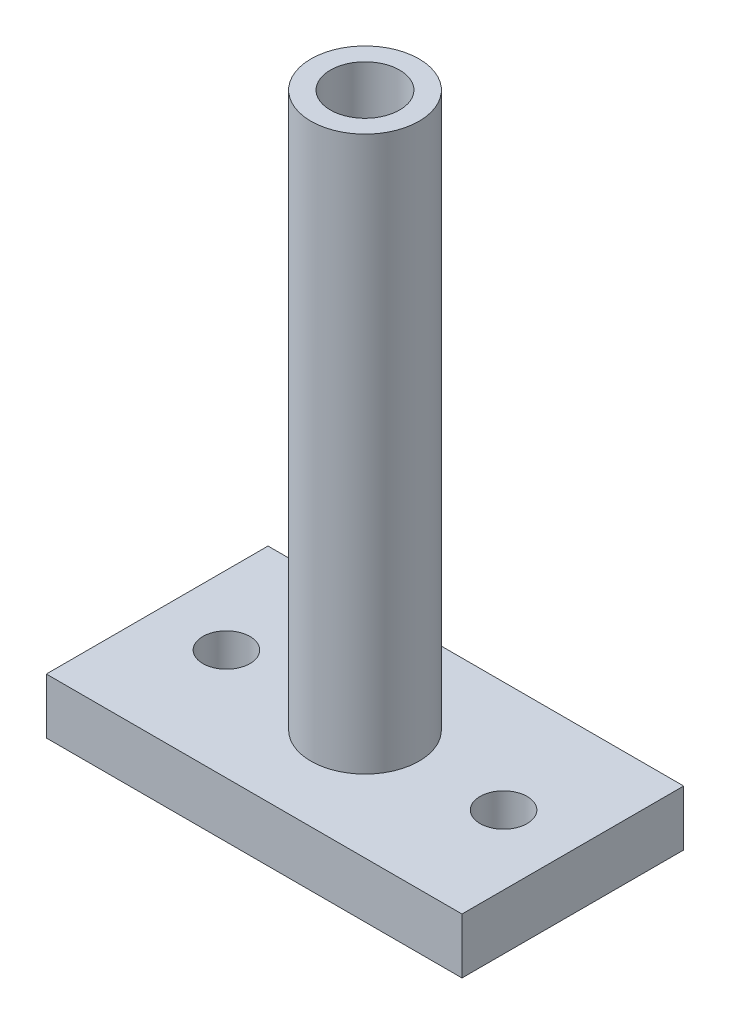
ISO-10303-21;
HEADER;
FILE_DESCRIPTION(('STEP AP214'),'2;1');
FILE_NAME('part.step','',(''),(''),'','','');
FILE_SCHEMA(('AUTOMOTIVE_DESIGN { 1 0 10303 214 1 1 1 1 }'));
ENDSEC;
DATA;
#1=APPLICATION_CONTEXT('core data for automotive mechanical design processes');
#2=APPLICATION_PROTOCOL_DEFINITION('international standard','automotive_design',2000,#1);
#3=PRODUCT_CONTEXT('',#1,'mechanical');
#4=PRODUCT('Part','Part','',(#3));
#5=PRODUCT_RELATED_PRODUCT_CATEGORY('part','',(#4));
#6=PRODUCT_DEFINITION_FORMATION('','',#4);
#7=PRODUCT_DEFINITION_CONTEXT('part definition',#1,'design');
#8=PRODUCT_DEFINITION('design','',#6,#7);
#9=PRODUCT_DEFINITION_SHAPE('','',#8);
#10=(LENGTH_UNIT() NAMED_UNIT(*) SI_UNIT(.MILLI.,.METRE.));
#11=(NAMED_UNIT(*) PLANE_ANGLE_UNIT() SI_UNIT($,.RADIAN.));
#12=(NAMED_UNIT(*) SI_UNIT($,.STERADIAN.) SOLID_ANGLE_UNIT());
#13=UNCERTAINTY_MEASURE_WITH_UNIT(LENGTH_MEASURE(1.E-05),#10,'distance_accuracy_value','');
#14=(GEOMETRIC_REPRESENTATION_CONTEXT(3) GLOBAL_UNCERTAINTY_ASSIGNED_CONTEXT((#13)) GLOBAL_UNIT_ASSIGNED_CONTEXT((#10,
#11,#12)) REPRESENTATION_CONTEXT('',''));
#15=CARTESIAN_POINT('',(0.,0.,0.));
#16=DIRECTION('',(0.,0.,1.));
#17=DIRECTION('',(1.,0.,0.));
#18=AXIS2_PLACEMENT_3D('',#15,#16,#17);
#19=CARTESIAN_POINT('',(0.,2.,0.));
#20=DIRECTION('',(0.,-1.,0.));
#21=DIRECTION('',(0.,0.,-1.));
#22=AXIS2_PLACEMENT_3D('',#19,#20,#21);
#23=PLANE('',#22);
#24=CARTESIAN_POINT('',(7.5,2.,-4.));
#25=DIRECTION('',(0.,-1.,0.));
#26=DIRECTION('',(0.,0.,-1.));
#27=AXIS2_PLACEMENT_3D('',#24,#25,#26);
#28=CIRCLE('',#27,1.95);
#29=CARTESIAN_POINT('',(7.5,2.,-5.95));
#30=VERTEX_POINT('',#29);
#31=EDGE_CURVE('E11',#30,#30,#28,.F.);
#32=ORIENTED_EDGE('',*,*,#31,.F.);
#33=EDGE_LOOP('',(#32));
#34=FACE_BOUND('',#33,.T.);
#35=DIRECTION('',(0.,0.,1.));
#36=VECTOR('',#35,1.);
#37=CARTESIAN_POINT('',(0.,2.,0.));
#38=LINE('',#37,#36);
#39=CARTESIAN_POINT('',(0.,2.,-8.));
#40=VERTEX_POINT('',#39);
#41=CARTESIAN_POINT('',(0.,2.,0.));
#42=VERTEX_POINT('',#41);
#43=EDGE_CURVE('E99',#40,#42,#38,.T.);
#44=ORIENTED_EDGE('',*,*,#43,.T.);
#45=DIRECTION('',(1.,0.,0.));
#46=VECTOR('',#45,1.);
#47=CARTESIAN_POINT('',(0.,2.,0.));
#48=LINE('',#47,#46);
#49=CARTESIAN_POINT('',(15.,2.,0.));
#50=VERTEX_POINT('',#49);
#51=EDGE_CURVE('E94',#42,#50,#48,.T.);
#52=ORIENTED_EDGE('',*,*,#51,.T.);
#53=DIRECTION('',(0.,0.,-1.));
#54=VECTOR('',#53,1.);
#55=CARTESIAN_POINT('',(15.,2.,0.));
#56=LINE('',#55,#54);
#57=CARTESIAN_POINT('',(15.,2.,-8.));
#58=VERTEX_POINT('',#57);
#59=EDGE_CURVE('E97',#50,#58,#56,.T.);
#60=ORIENTED_EDGE('',*,*,#59,.T.);
#61=DIRECTION('',(-1.,0.,0.));
#62=VECTOR('',#61,1.);
#63=CARTESIAN_POINT('',(0.,2.,-8.));
#64=LINE('',#63,#62);
#65=EDGE_CURVE('E63',#58,#40,#64,.T.);
#66=ORIENTED_EDGE('',*,*,#65,.T.);
#67=EDGE_LOOP('',(#44,#52,#60,#66));
#68=FACE_BOUND('',#67,.T.);
#69=CARTESIAN_POINT('',(2.5,2.,-4.));
#70=DIRECTION('',(0.,1.,0.));
#71=DIRECTION('',(0.,0.,1.));
#72=AXIS2_PLACEMENT_3D('',#69,#70,#71);
#73=CIRCLE('',#72,0.85);
#74=CARTESIAN_POINT('',(2.5,2.,-3.15));
#75=VERTEX_POINT('',#74);
#76=EDGE_CURVE('E121',#75,#75,#73,.T.);
#77=ORIENTED_EDGE('',*,*,#76,.F.);
#78=EDGE_LOOP('',(#77));
#79=FACE_BOUND('',#78,.T.);
#80=CARTESIAN_POINT('',(12.5,2.,-4.));
#81=DIRECTION('',(0.,1.,0.));
#82=DIRECTION('',(0.,0.,-1.));
#83=AXIS2_PLACEMENT_3D('',#80,#81,#82);
#84=CIRCLE('',#83,0.85);
#85=CARTESIAN_POINT('',(12.5,2.,-4.85));
#86=VERTEX_POINT('',#85);
#87=EDGE_CURVE('E145',#86,#86,#84,.T.);
#88=ORIENTED_EDGE('',*,*,#87,.F.);
#89=EDGE_LOOP('',(#88));
#90=FACE_BOUND('',#89,.T.);
#91=ADVANCED_FACE('F45',(#34,#68,#79,#90),#23,.F.);
#92=CARTESIAN_POINT('',(0.,0.,0.));
#93=DIRECTION('',(0.,-1.,0.));
#94=DIRECTION('',(0.,0.,-1.));
#95=AXIS2_PLACEMENT_3D('',#92,#93,#94);
#96=PLANE('',#95);
#97=CARTESIAN_POINT('',(2.5,0.,-4.));
#98=DIRECTION('',(0.,1.,0.));
#99=DIRECTION('',(0.,0.,1.));
#100=AXIS2_PLACEMENT_3D('',#97,#98,#99);
#101=CIRCLE('',#100,0.85);
#102=CARTESIAN_POINT('',(2.5,0.,-3.15));
#103=VERTEX_POINT('',#102);
#104=EDGE_CURVE('E151',#103,#103,#101,.T.);
#105=ORIENTED_EDGE('',*,*,#104,.T.);
#106=EDGE_LOOP('',(#105));
#107=FACE_BOUND('',#106,.T.);
#108=DIRECTION('',(0.,0.,1.));
#109=VECTOR('',#108,1.);
#110=CARTESIAN_POINT('',(0.,0.,0.));
#111=LINE('',#110,#109);
#112=CARTESIAN_POINT('',(0.,0.,-8.));
#113=VERTEX_POINT('',#112);
#114=CARTESIAN_POINT('',(0.,0.,0.));
#115=VERTEX_POINT('',#114);
#116=EDGE_CURVE('E117',#113,#115,#111,.T.);
#117=ORIENTED_EDGE('',*,*,#116,.F.);
#118=DIRECTION('',(-1.,0.,0.));
#119=VECTOR('',#118,1.);
#120=CARTESIAN_POINT('',(0.,0.,-8.));
#121=LINE('',#120,#119);
#122=CARTESIAN_POINT('',(15.,0.,-8.));
#123=VERTEX_POINT('',#122);
#124=EDGE_CURVE('E86',#123,#113,#121,.T.);
#125=ORIENTED_EDGE('',*,*,#124,.F.);
#126=DIRECTION('',(0.,0.,-1.));
#127=VECTOR('',#126,1.);
#128=CARTESIAN_POINT('',(15.,0.,0.));
#129=LINE('',#128,#127);
#130=CARTESIAN_POINT('',(15.,0.,0.));
#131=VERTEX_POINT('',#130);
#132=EDGE_CURVE('E80',#131,#123,#129,.T.);
#133=ORIENTED_EDGE('',*,*,#132,.F.);
#134=DIRECTION('',(1.,0.,0.));
#135=VECTOR('',#134,1.);
#136=CARTESIAN_POINT('',(0.,0.,0.));
#137=LINE('',#136,#135);
#138=EDGE_CURVE('E105',#115,#131,#137,.T.);
#139=ORIENTED_EDGE('',*,*,#138,.F.);
#140=EDGE_LOOP('',(#117,#125,#133,#139));
#141=FACE_BOUND('',#140,.T.);
#142=CARTESIAN_POINT('',(12.5,0.,-4.));
#143=DIRECTION('',(0.,1.,0.));
#144=DIRECTION('',(0.,0.,-1.));
#145=AXIS2_PLACEMENT_3D('',#142,#143,#144);
#146=CIRCLE('',#145,0.85);
#147=CARTESIAN_POINT('',(12.5,0.,-4.85));
#148=VERTEX_POINT('',#147);
#149=EDGE_CURVE('E142',#148,#148,#146,.T.);
#150=ORIENTED_EDGE('',*,*,#149,.T.);
#151=EDGE_LOOP('',(#150));
#152=FACE_BOUND('',#151,.T.);
#153=ADVANCED_FACE('F135',(#107,#141,#152),#96,.T.);
#154=CARTESIAN_POINT('',(0.,2.,0.));
#155=DIRECTION('',(1.,0.,0.));
#156=DIRECTION('',(0.,0.,-1.));
#157=AXIS2_PLACEMENT_3D('',#154,#155,#156);
#158=PLANE('',#157);
#159=ORIENTED_EDGE('',*,*,#116,.T.);
#160=DIRECTION('',(0.,-1.,0.));
#161=VECTOR('',#160,1.);
#162=CARTESIAN_POINT('',(0.,2.,0.));
#163=LINE('',#162,#161);
#164=EDGE_CURVE('E55',#42,#115,#163,.T.);
#165=ORIENTED_EDGE('',*,*,#164,.F.);
#166=ORIENTED_EDGE('',*,*,#43,.F.);
#167=DIRECTION('',(0.,-1.,0.));
#168=VECTOR('',#167,1.);
#169=CARTESIAN_POINT('',(0.,2.,-8.));
#170=LINE('',#169,#168);
#171=EDGE_CURVE('E113',#40,#113,#170,.T.);
#172=ORIENTED_EDGE('',*,*,#171,.T.);
#173=EDGE_LOOP('',(#159,#165,#166,#172));
#174=FACE_BOUND('',#173,.T.);
#175=ADVANCED_FACE('F47',(#174),#158,.F.);
#176=CARTESIAN_POINT('',(0.,2.,0.));
#177=DIRECTION('',(0.,0.,-1.));
#178=DIRECTION('',(-1.,0.,0.));
#179=AXIS2_PLACEMENT_3D('',#176,#177,#178);
#180=PLANE('',#179);
#181=ORIENTED_EDGE('',*,*,#138,.T.);
#182=DIRECTION('',(0.,-1.,0.));
#183=VECTOR('',#182,1.);
#184=CARTESIAN_POINT('',(15.,2.,0.));
#185=LINE('',#184,#183);
#186=EDGE_CURVE('E103',#50,#131,#185,.T.);
#187=ORIENTED_EDGE('',*,*,#186,.F.);
#188=ORIENTED_EDGE('',*,*,#51,.F.);
#189=ORIENTED_EDGE('',*,*,#164,.T.);
#190=EDGE_LOOP('',(#181,#187,#188,#189));
#191=FACE_BOUND('',#190,.T.);
#192=ADVANCED_FACE('F104',(#191),#180,.F.);
#193=CARTESIAN_POINT('',(15.,2.,0.));
#194=DIRECTION('',(-1.,0.,0.));
#195=DIRECTION('',(0.,0.,1.));
#196=AXIS2_PLACEMENT_3D('',#193,#194,#195);
#197=PLANE('',#196);
#198=ORIENTED_EDGE('',*,*,#132,.T.);
#199=DIRECTION('',(0.,-1.,0.));
#200=VECTOR('',#199,1.);
#201=CARTESIAN_POINT('',(15.,2.,-8.));
#202=LINE('',#201,#200);
#203=EDGE_CURVE('E107',#58,#123,#202,.T.);
#204=ORIENTED_EDGE('',*,*,#203,.F.);
#205=ORIENTED_EDGE('',*,*,#59,.F.);
#206=ORIENTED_EDGE('',*,*,#186,.T.);
#207=EDGE_LOOP('',(#198,#204,#205,#206));
#208=FACE_BOUND('',#207,.T.);
#209=ADVANCED_FACE('F109',(#208),#197,.F.);
#210=CARTESIAN_POINT('',(0.,2.,-8.));
#211=DIRECTION('',(0.,0.,1.));
#212=DIRECTION('',(1.,0.,0.));
#213=AXIS2_PLACEMENT_3D('',#210,#211,#212);
#214=PLANE('',#213);
#215=ORIENTED_EDGE('',*,*,#124,.T.);
#216=ORIENTED_EDGE('',*,*,#171,.F.);
#217=ORIENTED_EDGE('',*,*,#65,.F.);
#218=ORIENTED_EDGE('',*,*,#203,.T.);
#219=EDGE_LOOP('',(#215,#216,#217,#218));
#220=FACE_BOUND('',#219,.T.);
#221=ADVANCED_FACE('F168',(#220),#214,.F.);
#222=CARTESIAN_POINT('',(2.5,2.,-4.));
#223=DIRECTION('',(0.,-1.,0.));
#224=DIRECTION('',(0.,0.,-1.));
#225=AXIS2_PLACEMENT_3D('',#222,#223,#224);
#226=CYLINDRICAL_SURFACE('',#225,0.85);
#227=ORIENTED_EDGE('',*,*,#76,.T.);
#228=EDGE_LOOP('',(#227));
#229=FACE_BOUND('',#228,.T.);
#230=ORIENTED_EDGE('',*,*,#104,.F.);
#231=EDGE_LOOP('',(#230));
#232=FACE_BOUND('',#231,.T.);
#233=ADVANCED_FACE('F165',(#229,#232),#226,.F.);
#234=CARTESIAN_POINT('',(12.5,2.,-4.));
#235=DIRECTION('',(0.,-1.,0.));
#236=DIRECTION('',(0.,0.,-1.));
#237=AXIS2_PLACEMENT_3D('',#234,#235,#236);
#238=CYLINDRICAL_SURFACE('',#237,0.85);
#239=ORIENTED_EDGE('',*,*,#87,.T.);
#240=EDGE_LOOP('',(#239));
#241=FACE_BOUND('',#240,.T.);
#242=ORIENTED_EDGE('',*,*,#149,.F.);
#243=EDGE_LOOP('',(#242));
#244=FACE_BOUND('',#243,.T.);
#245=ADVANCED_FACE('F167',(#241,#244),#238,.F.);
#246=CARTESIAN_POINT('',(7.5,22.,-4.));
#247=DIRECTION('',(0.,-1.,0.));
#248=DIRECTION('',(0.,0.,-1.));
#249=AXIS2_PLACEMENT_3D('',#246,#247,#248);
#250=CYLINDRICAL_SURFACE('',#249,1.95);
#251=CARTESIAN_POINT('',(7.5,22.,-4.));
#252=DIRECTION('',(0.,1.,0.));
#253=DIRECTION('',(0.,0.,1.));
#254=AXIS2_PLACEMENT_3D('',#251,#252,#253);
#255=CIRCLE('',#254,1.95);
#256=CARTESIAN_POINT('',(7.5,22.,-2.05));
#257=VERTEX_POINT('',#256);
#258=EDGE_CURVE('E146',#257,#257,#255,.T.);
#259=ORIENTED_EDGE('',*,*,#258,.F.);
#260=EDGE_LOOP('',(#259));
#261=FACE_BOUND('',#260,.T.);
#262=ORIENTED_EDGE('',*,*,#31,.T.);
#263=EDGE_LOOP('',(#262));
#264=FACE_BOUND('',#263,.T.);
#265=ADVANCED_FACE('F175',(#261,#264),#250,.T.);
#266=CARTESIAN_POINT('',(7.5,22.,-4.));
#267=DIRECTION('',(0.,1.,0.));
#268=DIRECTION('',(0.,0.,1.));
#269=AXIS2_PLACEMENT_3D('',#266,#267,#268);
#270=PLANE('',#269);
#271=CARTESIAN_POINT('',(7.5,22.,-4.));
#272=DIRECTION('',(0.,1.,0.));
#273=DIRECTION('',(0.,0.,1.));
#274=AXIS2_PLACEMENT_3D('',#271,#272,#273);
#275=CIRCLE('',#274,1.25);
#276=CARTESIAN_POINT('',(7.5,22.,-2.75));
#277=VERTEX_POINT('',#276);
#278=EDGE_CURVE('E272',#277,#277,#275,.T.);
#279=ORIENTED_EDGE('',*,*,#278,.F.);
#280=EDGE_LOOP('',(#279));
#281=FACE_BOUND('',#280,.T.);
#282=ORIENTED_EDGE('',*,*,#258,.T.);
#283=EDGE_LOOP('',(#282));
#284=FACE_BOUND('',#283,.T.);
#285=ADVANCED_FACE('F235',(#281,#284),#270,.T.);
#286=CARTESIAN_POINT('',(7.5,12.,-4.));
#287=DIRECTION('',(0.,1.,0.));
#288=DIRECTION('',(0.,0.,1.));
#289=AXIS2_PLACEMENT_3D('',#286,#287,#288);
#290=CYLINDRICAL_SURFACE('',#289,1.25);
#291=CARTESIAN_POINT('',(7.5,12.,-4.));
#292=DIRECTION('',(0.,1.,0.));
#293=DIRECTION('',(0.,0.,1.));
#294=AXIS2_PLACEMENT_3D('',#291,#292,#293);
#295=CIRCLE('',#294,1.25);
#296=CARTESIAN_POINT('',(7.5,12.,-2.75));
#297=VERTEX_POINT('',#296);
#298=EDGE_CURVE('E154',#297,#297,#295,.T.);
#299=ORIENTED_EDGE('',*,*,#298,.F.);
#300=EDGE_LOOP('',(#299));
#301=FACE_BOUND('',#300,.T.);
#302=ORIENTED_EDGE('',*,*,#278,.T.);
#303=EDGE_LOOP('',(#302));
#304=FACE_BOUND('',#303,.T.);
#305=ADVANCED_FACE('F244',(#301,#304),#290,.F.);
#306=CARTESIAN_POINT('',(7.5,12.,-4.));
#307=DIRECTION('',(0.,1.,0.));
#308=DIRECTION('',(0.,0.,1.));
#309=AXIS2_PLACEMENT_3D('',#306,#307,#308);
#310=PLANE('',#309);
#311=ORIENTED_EDGE('',*,*,#298,.T.);
#312=EDGE_LOOP('',(#311));
#313=FACE_BOUND('',#312,.T.);
#314=ADVANCED_FACE('F253',(#313),#310,.T.);
#315=CLOSED_SHELL('',(#91,#153,#175,#192,#209,#221,#233,#245,#265,#285,#305,#314));
#316=MANIFOLD_SOLID_BREP('B2',#315);
#317=ADVANCED_BREP_SHAPE_REPRESENTATION('',(#18,#316),#14);
#318=SHAPE_DEFINITION_REPRESENTATION(#9,#317);
ENDSEC;
END-ISO-10303-21;
